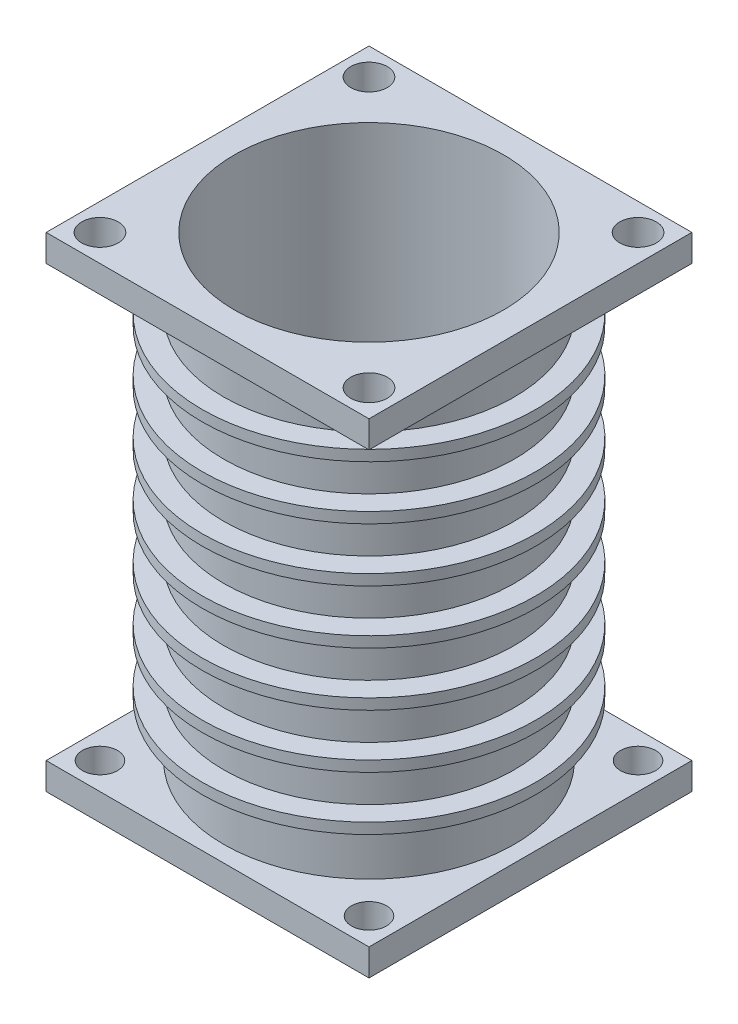
ISO-10303-21;
HEADER;
FILE_DESCRIPTION(('STEP AP214'),'2;1');
FILE_NAME('part.step','',(''),(''),'','','');
FILE_SCHEMA(('AUTOMOTIVE_DESIGN { 1 0 10303 214 1 1 1 1 }'));
ENDSEC;
DATA;
#1=APPLICATION_CONTEXT('core data for automotive mechanical design processes');
#2=APPLICATION_PROTOCOL_DEFINITION('international standard','automotive_design',2000,#1);
#3=PRODUCT_CONTEXT('',#1,'mechanical');
#4=PRODUCT('Part','Part','',(#3));
#5=PRODUCT_RELATED_PRODUCT_CATEGORY('part','',(#4));
#6=PRODUCT_DEFINITION_FORMATION('','',#4);
#7=PRODUCT_DEFINITION_CONTEXT('part definition',#1,'design');
#8=PRODUCT_DEFINITION('design','',#6,#7);
#9=PRODUCT_DEFINITION_SHAPE('','',#8);
#10=(LENGTH_UNIT() NAMED_UNIT(*) SI_UNIT(.MILLI.,.METRE.));
#11=(NAMED_UNIT(*) PLANE_ANGLE_UNIT() SI_UNIT($,.RADIAN.));
#12=(NAMED_UNIT(*) SI_UNIT($,.STERADIAN.) SOLID_ANGLE_UNIT());
#13=UNCERTAINTY_MEASURE_WITH_UNIT(LENGTH_MEASURE(1.E-05),#10,'distance_accuracy_value','');
#14=(GEOMETRIC_REPRESENTATION_CONTEXT(3) GLOBAL_UNCERTAINTY_ASSIGNED_CONTEXT((#13)) GLOBAL_UNIT_ASSIGNED_CONTEXT((#10,
#11,#12)) REPRESENTATION_CONTEXT('',''));
#15=CARTESIAN_POINT('',(0.,0.,0.));
#16=DIRECTION('',(0.,0.,1.));
#17=DIRECTION('',(1.,0.,0.));
#18=AXIS2_PLACEMENT_3D('',#15,#16,#17);
#19=CARTESIAN_POINT('',(0.,113.074454152936,0.));
#20=DIRECTION('',(0.,-1.,0.));
#21=DIRECTION('',(0.,0.,-1.));
#22=AXIS2_PLACEMENT_3D('',#19,#20,#21);
#23=CYLINDRICAL_SURFACE('',#22,54.);
#24=CARTESIAN_POINT('',(0.,77.0744541529356,0.));
#25=DIRECTION('',(0.,1.,0.));
#26=DIRECTION('',(0.,0.,1.));
#27=AXIS2_PLACEMENT_3D('',#24,#25,#26);
#28=CIRCLE('',#27,54.);
#29=CARTESIAN_POINT('',(0.,77.0744541529356,54.));
#30=VERTEX_POINT('',#29);
#31=EDGE_CURVE('E175',#30,#30,#28,.T.);
#32=ORIENTED_EDGE('',*,*,#31,.T.);
#33=EDGE_LOOP('',(#32));
#34=FACE_BOUND('',#33,.T.);
#35=CARTESIAN_POINT('',(0.,93.0744541529356,0.));
#36=DIRECTION('',(0.,1.,0.));
#37=DIRECTION('',(0.,0.,1.));
#38=AXIS2_PLACEMENT_3D('',#35,#36,#37);
#39=CIRCLE('',#38,54.);
#40=CARTESIAN_POINT('',(0.,93.0744541529356,54.));
#41=VERTEX_POINT('',#40);
#42=EDGE_CURVE('E244',#41,#41,#39,.T.);
#43=ORIENTED_EDGE('',*,*,#42,.F.);
#44=EDGE_LOOP('',(#43));
#45=FACE_BOUND('',#44,.T.);
#46=ADVANCED_FACE('F37',(#34,#45),#23,.T.);
#47=CARTESIAN_POINT('',(0.,93.0744541529356,0.));
#48=DIRECTION('',(0.,1.,0.));
#49=DIRECTION('',(0.,0.,1.));
#50=AXIS2_PLACEMENT_3D('',#47,#48,#49);
#51=PLANE('',#50);
#52=ORIENTED_EDGE('',*,*,#42,.T.);
#53=EDGE_LOOP('',(#52));
#54=FACE_BOUND('',#53,.T.);
#55=CARTESIAN_POINT('',(0.,93.0744541529356,0.));
#56=DIRECTION('',(0.,1.,0.));
#57=DIRECTION('',(0.,0.,1.));
#58=AXIS2_PLACEMENT_3D('',#55,#56,#57);
#59=CIRCLE('',#58,62.);
#60=CARTESIAN_POINT('',(0.,93.0744541529356,62.));
#61=VERTEX_POINT('',#60);
#62=EDGE_CURVE('E183',#61,#61,#59,.T.);
#63=ORIENTED_EDGE('',*,*,#62,.F.);
#64=EDGE_LOOP('',(#63));
#65=FACE_BOUND('',#64,.T.);
#66=ADVANCED_FACE('F301',(#54,#65),#51,.F.);
#67=CARTESIAN_POINT('',(0.,97.0744541529356,0.));
#68=DIRECTION('',(0.,1.,0.));
#69=DIRECTION('',(0.,0.,1.));
#70=AXIS2_PLACEMENT_3D('',#67,#68,#69);
#71=PLANE('',#70);
#72=CARTESIAN_POINT('',(0.,97.0744541529356,0.));
#73=DIRECTION('',(0.,1.,0.));
#74=DIRECTION('',(0.,0.,1.));
#75=AXIS2_PLACEMENT_3D('',#72,#73,#74);
#76=CIRCLE('',#75,54.);
#77=CARTESIAN_POINT('',(0.,97.0744541529356,54.));
#78=VERTEX_POINT('',#77);
#79=EDGE_CURVE('E182',#78,#78,#76,.T.);
#80=ORIENTED_EDGE('',*,*,#79,.F.);
#81=EDGE_LOOP('',(#80));
#82=FACE_BOUND('',#81,.T.);
#83=CARTESIAN_POINT('',(0.,97.0744541529356,0.));
#84=DIRECTION('',(0.,1.,0.));
#85=DIRECTION('',(0.,0.,1.));
#86=AXIS2_PLACEMENT_3D('',#83,#84,#85);
#87=CIRCLE('',#86,62.);
#88=CARTESIAN_POINT('',(0.,97.0744541529356,62.));
#89=VERTEX_POINT('',#88);
#90=EDGE_CURVE('E179',#89,#89,#87,.T.);
#91=ORIENTED_EDGE('',*,*,#90,.T.);
#92=EDGE_LOOP('',(#91));
#93=FACE_BOUND('',#92,.T.);
#94=ADVANCED_FACE('F308',(#82,#93),#71,.T.);
#95=CARTESIAN_POINT('',(0.,97.0744541529356,0.));
#96=DIRECTION('',(0.,-1.,0.));
#97=DIRECTION('',(0.,0.,-1.));
#98=AXIS2_PLACEMENT_3D('',#95,#96,#97);
#99=CYLINDRICAL_SURFACE('',#98,62.);
#100=ORIENTED_EDGE('',*,*,#90,.F.);
#101=EDGE_LOOP('',(#100));
#102=FACE_BOUND('',#101,.T.);
#103=ORIENTED_EDGE('',*,*,#62,.T.);
#104=EDGE_LOOP('',(#103));
#105=FACE_BOUND('',#104,.T.);
#106=ADVANCED_FACE('F395',(#102,#105),#99,.T.);
#107=CARTESIAN_POINT('',(0.,-56.9255458470644,0.));
#108=DIRECTION('',(0.,1.,0.));
#109=DIRECTION('',(0.,0.,1.));
#110=AXIS2_PLACEMENT_3D('',#107,#108,#109);
#111=CYLINDRICAL_SURFACE('',#110,50.);
#112=CARTESIAN_POINT('',(0.,-56.9255458470644,0.));
#113=DIRECTION('',(0.,1.,0.));
#114=DIRECTION('',(0.,0.,1.));
#115=AXIS2_PLACEMENT_3D('',#112,#113,#114);
#116=CIRCLE('',#115,50.);
#117=CARTESIAN_POINT('',(0.,-56.9255458470644,50.));
#118=VERTEX_POINT('',#117);
#119=EDGE_CURVE('E189',#118,#118,#116,.T.);
#120=ORIENTED_EDGE('',*,*,#119,.F.);
#121=EDGE_LOOP('',(#120));
#122=FACE_BOUND('',#121,.T.);
#123=CARTESIAN_POINT('',(0.,123.074454152936,0.));
#124=DIRECTION('',(0.,1.,0.));
#125=DIRECTION('',(0.,0.,1.));
#126=AXIS2_PLACEMENT_3D('',#123,#124,#125);
#127=CIRCLE('',#126,50.);
#128=CARTESIAN_POINT('',(0.,123.074454152936,50.));
#129=VERTEX_POINT('',#128);
#130=EDGE_CURVE('E555',#129,#129,#127,.F.);
#131=ORIENTED_EDGE('',*,*,#130,.F.);
#132=EDGE_LOOP('',(#131));
#133=FACE_BOUND('',#132,.T.);
#134=ADVANCED_FACE('F316',(#122,#133),#111,.F.);
#135=ORIENTED_EDGE('',*,*,#79,.T.);
#136=EDGE_LOOP('',(#135));
#137=FACE_BOUND('',#136,.T.);
#138=CARTESIAN_POINT('',(0.,113.074454152936,0.));
#139=DIRECTION('',(0.,1.,0.));
#140=DIRECTION('',(0.,0.,1.));
#141=AXIS2_PLACEMENT_3D('',#138,#139,#140);
#142=CIRCLE('',#141,54.);
#143=CARTESIAN_POINT('',(0.,113.074454152936,54.));
#144=VERTEX_POINT('',#143);
#145=EDGE_CURVE('E186',#144,#144,#142,.T.);
#146=ORIENTED_EDGE('',*,*,#145,.F.);
#147=EDGE_LOOP('',(#146));
#148=FACE_BOUND('',#147,.T.);
#149=ADVANCED_FACE('F303',(#137,#148),#23,.T.);
#150=CARTESIAN_POINT('',(0.,73.0744541529356,0.));
#151=DIRECTION('',(0.,1.,0.));
#152=DIRECTION('',(0.,0.,1.));
#153=AXIS2_PLACEMENT_3D('',#150,#151,#152);
#154=PLANE('',#153);
#155=CARTESIAN_POINT('',(0.,73.0744541529356,0.));
#156=DIRECTION('',(0.,1.,0.));
#157=DIRECTION('',(0.,0.,1.));
#158=AXIS2_PLACEMENT_3D('',#155,#156,#157);
#159=CIRCLE('',#158,54.);
#160=CARTESIAN_POINT('',(0.,73.0744541529356,54.));
#161=VERTEX_POINT('',#160);
#162=EDGE_CURVE('E247',#161,#161,#159,.T.);
#163=ORIENTED_EDGE('',*,*,#162,.T.);
#164=EDGE_LOOP('',(#163));
#165=FACE_BOUND('',#164,.T.);
#166=CARTESIAN_POINT('',(0.,73.0744541529356,0.));
#167=DIRECTION('',(0.,1.,0.));
#168=DIRECTION('',(0.,0.,1.));
#169=AXIS2_PLACEMENT_3D('',#166,#167,#168);
#170=CIRCLE('',#169,62.);
#171=CARTESIAN_POINT('',(0.,73.0744541529356,62.));
#172=VERTEX_POINT('',#171);
#173=EDGE_CURVE('E176',#172,#172,#170,.T.);
#174=ORIENTED_EDGE('',*,*,#173,.F.);
#175=EDGE_LOOP('',(#174));
#176=FACE_BOUND('',#175,.T.);
#177=ADVANCED_FACE('F315',(#165,#176),#154,.F.);
#178=CARTESIAN_POINT('',(0.,77.0744541529356,0.));
#179=DIRECTION('',(0.,1.,0.));
#180=DIRECTION('',(0.,0.,1.));
#181=AXIS2_PLACEMENT_3D('',#178,#179,#180);
#182=PLANE('',#181);
#183=ORIENTED_EDGE('',*,*,#31,.F.);
#184=EDGE_LOOP('',(#183));
#185=FACE_BOUND('',#184,.T.);
#186=CARTESIAN_POINT('',(0.,77.0744541529356,0.));
#187=DIRECTION('',(0.,1.,0.));
#188=DIRECTION('',(0.,0.,1.));
#189=AXIS2_PLACEMENT_3D('',#186,#187,#188);
#190=CIRCLE('',#189,62.);
#191=CARTESIAN_POINT('',(0.,77.0744541529356,62.));
#192=VERTEX_POINT('',#191);
#193=EDGE_CURVE('E172',#192,#192,#190,.T.);
#194=ORIENTED_EDGE('',*,*,#193,.T.);
#195=EDGE_LOOP('',(#194));
#196=FACE_BOUND('',#195,.T.);
#197=ADVANCED_FACE('F331',(#185,#196),#182,.T.);
#198=CARTESIAN_POINT('',(0.,77.0744541529356,0.));
#199=DIRECTION('',(0.,-1.,0.));
#200=DIRECTION('',(0.,0.,-1.));
#201=AXIS2_PLACEMENT_3D('',#198,#199,#200);
#202=CYLINDRICAL_SURFACE('',#201,62.);
#203=ORIENTED_EDGE('',*,*,#193,.F.);
#204=EDGE_LOOP('',(#203));
#205=FACE_BOUND('',#204,.T.);
#206=ORIENTED_EDGE('',*,*,#173,.T.);
#207=EDGE_LOOP('',(#206));
#208=FACE_BOUND('',#207,.T.);
#209=ADVANCED_FACE('F321',(#205,#208),#202,.T.);
#210=CARTESIAN_POINT('',(0.,57.0744541529356,0.));
#211=DIRECTION('',(0.,1.,0.));
#212=DIRECTION('',(0.,0.,1.));
#213=AXIS2_PLACEMENT_3D('',#210,#211,#212);
#214=CIRCLE('',#213,54.);
#215=CARTESIAN_POINT('',(0.,57.0744541529356,54.));
#216=VERTEX_POINT('',#215);
#217=EDGE_CURVE('E168',#216,#216,#214,.T.);
#218=ORIENTED_EDGE('',*,*,#217,.T.);
#219=EDGE_LOOP('',(#218));
#220=FACE_BOUND('',#219,.T.);
#221=ORIENTED_EDGE('',*,*,#162,.F.);
#222=EDGE_LOOP('',(#221));
#223=FACE_BOUND('',#222,.T.);
#224=ADVANCED_FACE('F304',(#220,#223),#23,.T.);
#225=CARTESIAN_POINT('',(0.,53.0744541529356,0.));
#226=DIRECTION('',(0.,1.,0.));
#227=DIRECTION('',(0.,0.,1.));
#228=AXIS2_PLACEMENT_3D('',#225,#226,#227);
#229=PLANE('',#228);
#230=CARTESIAN_POINT('',(0.,53.0744541529356,0.));
#231=DIRECTION('',(0.,1.,0.));
#232=DIRECTION('',(0.,0.,1.));
#233=AXIS2_PLACEMENT_3D('',#230,#231,#232);
#234=CIRCLE('',#233,54.);
#235=CARTESIAN_POINT('',(0.,53.0744541529356,54.));
#236=VERTEX_POINT('',#235);
#237=EDGE_CURVE('E252',#236,#236,#234,.T.);
#238=ORIENTED_EDGE('',*,*,#237,.T.);
#239=EDGE_LOOP('',(#238));
#240=FACE_BOUND('',#239,.T.);
#241=CARTESIAN_POINT('',(0.,53.0744541529356,0.));
#242=DIRECTION('',(0.,1.,0.));
#243=DIRECTION('',(0.,0.,1.));
#244=AXIS2_PLACEMENT_3D('',#241,#242,#243);
#245=CIRCLE('',#244,62.);
#246=CARTESIAN_POINT('',(0.,53.0744541529356,62.));
#247=VERTEX_POINT('',#246);
#248=EDGE_CURVE('E169',#247,#247,#245,.T.);
#249=ORIENTED_EDGE('',*,*,#248,.F.);
#250=EDGE_LOOP('',(#249));
#251=FACE_BOUND('',#250,.T.);
#252=ADVANCED_FACE('F320',(#240,#251),#229,.F.);
#253=CARTESIAN_POINT('',(0.,57.0744541529356,0.));
#254=DIRECTION('',(0.,1.,0.));
#255=DIRECTION('',(0.,0.,1.));
#256=AXIS2_PLACEMENT_3D('',#253,#254,#255);
#257=PLANE('',#256);
#258=ORIENTED_EDGE('',*,*,#217,.F.);
#259=EDGE_LOOP('',(#258));
#260=FACE_BOUND('',#259,.T.);
#261=CARTESIAN_POINT('',(0.,57.0744541529356,0.));
#262=DIRECTION('',(0.,1.,0.));
#263=DIRECTION('',(0.,0.,1.));
#264=AXIS2_PLACEMENT_3D('',#261,#262,#263);
#265=CIRCLE('',#264,62.);
#266=CARTESIAN_POINT('',(0.,57.0744541529356,62.));
#267=VERTEX_POINT('',#266);
#268=EDGE_CURVE('E165',#267,#267,#265,.T.);
#269=ORIENTED_EDGE('',*,*,#268,.T.);
#270=EDGE_LOOP('',(#269));
#271=FACE_BOUND('',#270,.T.);
#272=ADVANCED_FACE('F328',(#260,#271),#257,.T.);
#273=CARTESIAN_POINT('',(0.,57.0744541529356,0.));
#274=DIRECTION('',(0.,-1.,0.));
#275=DIRECTION('',(0.,0.,-1.));
#276=AXIS2_PLACEMENT_3D('',#273,#274,#275);
#277=CYLINDRICAL_SURFACE('',#276,62.);
#278=ORIENTED_EDGE('',*,*,#268,.F.);
#279=EDGE_LOOP('',(#278));
#280=FACE_BOUND('',#279,.T.);
#281=ORIENTED_EDGE('',*,*,#248,.T.);
#282=EDGE_LOOP('',(#281));
#283=FACE_BOUND('',#282,.T.);
#284=ADVANCED_FACE('F337',(#280,#283),#277,.T.);
#285=CARTESIAN_POINT('',(0.,37.0744541529356,0.));
#286=DIRECTION('',(0.,1.,0.));
#287=DIRECTION('',(0.,0.,1.));
#288=AXIS2_PLACEMENT_3D('',#285,#286,#287);
#289=CIRCLE('',#288,54.);
#290=CARTESIAN_POINT('',(0.,37.0744541529356,54.));
#291=VERTEX_POINT('',#290);
#292=EDGE_CURVE('E161',#291,#291,#289,.T.);
#293=ORIENTED_EDGE('',*,*,#292,.T.);
#294=EDGE_LOOP('',(#293));
#295=FACE_BOUND('',#294,.T.);
#296=ORIENTED_EDGE('',*,*,#237,.F.);
#297=EDGE_LOOP('',(#296));
#298=FACE_BOUND('',#297,.T.);
#299=ADVANCED_FACE('F323',(#295,#298),#23,.T.);
#300=CARTESIAN_POINT('',(0.,33.0744541529356,0.));
#301=DIRECTION('',(0.,1.,0.));
#302=DIRECTION('',(0.,0.,1.));
#303=AXIS2_PLACEMENT_3D('',#300,#301,#302);
#304=PLANE('',#303);
#305=CARTESIAN_POINT('',(0.,33.0744541529356,0.));
#306=DIRECTION('',(0.,1.,0.));
#307=DIRECTION('',(0.,0.,1.));
#308=AXIS2_PLACEMENT_3D('',#305,#306,#307);
#309=CIRCLE('',#308,54.);
#310=CARTESIAN_POINT('',(0.,33.0744541529356,54.));
#311=VERTEX_POINT('',#310);
#312=EDGE_CURVE('E257',#311,#311,#309,.T.);
#313=ORIENTED_EDGE('',*,*,#312,.T.);
#314=EDGE_LOOP('',(#313));
#315=FACE_BOUND('',#314,.T.);
#316=CARTESIAN_POINT('',(0.,33.0744541529356,0.));
#317=DIRECTION('',(0.,1.,0.));
#318=DIRECTION('',(0.,0.,1.));
#319=AXIS2_PLACEMENT_3D('',#316,#317,#318);
#320=CIRCLE('',#319,62.);
#321=CARTESIAN_POINT('',(0.,33.0744541529356,62.));
#322=VERTEX_POINT('',#321);
#323=EDGE_CURVE('E162',#322,#322,#320,.T.);
#324=ORIENTED_EDGE('',*,*,#323,.F.);
#325=EDGE_LOOP('',(#324));
#326=FACE_BOUND('',#325,.T.);
#327=ADVANCED_FACE('F336',(#315,#326),#304,.F.);
#328=CARTESIAN_POINT('',(0.,37.0744541529356,0.));
#329=DIRECTION('',(0.,1.,0.));
#330=DIRECTION('',(0.,0.,1.));
#331=AXIS2_PLACEMENT_3D('',#328,#329,#330);
#332=PLANE('',#331);
#333=ORIENTED_EDGE('',*,*,#292,.F.);
#334=EDGE_LOOP('',(#333));
#335=FACE_BOUND('',#334,.T.);
#336=CARTESIAN_POINT('',(0.,37.0744541529356,0.));
#337=DIRECTION('',(0.,1.,0.));
#338=DIRECTION('',(0.,0.,1.));
#339=AXIS2_PLACEMENT_3D('',#336,#337,#338);
#340=CIRCLE('',#339,62.);
#341=CARTESIAN_POINT('',(0.,37.0744541529356,62.));
#342=VERTEX_POINT('',#341);
#343=EDGE_CURVE('E158',#342,#342,#340,.T.);
#344=ORIENTED_EDGE('',*,*,#343,.T.);
#345=EDGE_LOOP('',(#344));
#346=FACE_BOUND('',#345,.T.);
#347=ADVANCED_FACE('F343',(#335,#346),#332,.T.);
#348=CARTESIAN_POINT('',(0.,37.0744541529356,0.));
#349=DIRECTION('',(0.,-1.,0.));
#350=DIRECTION('',(0.,0.,-1.));
#351=AXIS2_PLACEMENT_3D('',#348,#349,#350);
#352=CYLINDRICAL_SURFACE('',#351,62.);
#353=ORIENTED_EDGE('',*,*,#343,.F.);
#354=EDGE_LOOP('',(#353));
#355=FACE_BOUND('',#354,.T.);
#356=ORIENTED_EDGE('',*,*,#323,.T.);
#357=EDGE_LOOP('',(#356));
#358=FACE_BOUND('',#357,.T.);
#359=ADVANCED_FACE('F351',(#355,#358),#352,.T.);
#360=CARTESIAN_POINT('',(0.,17.0744541529356,0.));
#361=DIRECTION('',(0.,1.,0.));
#362=DIRECTION('',(0.,0.,1.));
#363=AXIS2_PLACEMENT_3D('',#360,#361,#362);
#364=CIRCLE('',#363,54.);
#365=CARTESIAN_POINT('',(0.,17.0744541529356,54.));
#366=VERTEX_POINT('',#365);
#367=EDGE_CURVE('E154',#366,#366,#364,.T.);
#368=ORIENTED_EDGE('',*,*,#367,.T.);
#369=EDGE_LOOP('',(#368));
#370=FACE_BOUND('',#369,.T.);
#371=ORIENTED_EDGE('',*,*,#312,.F.);
#372=EDGE_LOOP('',(#371));
#373=FACE_BOUND('',#372,.T.);
#374=ADVANCED_FACE('F299',(#370,#373),#23,.T.);
#375=CARTESIAN_POINT('',(0.,13.0744541529356,0.));
#376=DIRECTION('',(0.,1.,0.));
#377=DIRECTION('',(0.,0.,1.));
#378=AXIS2_PLACEMENT_3D('',#375,#376,#377);
#379=PLANE('',#378);
#380=CARTESIAN_POINT('',(0.,13.0744541529356,0.));
#381=DIRECTION('',(0.,1.,0.));
#382=DIRECTION('',(0.,0.,1.));
#383=AXIS2_PLACEMENT_3D('',#380,#381,#382);
#384=CIRCLE('',#383,54.);
#385=CARTESIAN_POINT('',(0.,13.0744541529356,54.));
#386=VERTEX_POINT('',#385);
#387=EDGE_CURVE('E262',#386,#386,#384,.T.);
#388=ORIENTED_EDGE('',*,*,#387,.T.);
#389=EDGE_LOOP('',(#388));
#390=FACE_BOUND('',#389,.T.);
#391=CARTESIAN_POINT('',(0.,13.0744541529356,0.));
#392=DIRECTION('',(0.,1.,0.));
#393=DIRECTION('',(0.,0.,1.));
#394=AXIS2_PLACEMENT_3D('',#391,#392,#393);
#395=CIRCLE('',#394,62.);
#396=CARTESIAN_POINT('',(0.,13.0744541529356,62.));
#397=VERTEX_POINT('',#396);
#398=EDGE_CURVE('E155',#397,#397,#395,.T.);
#399=ORIENTED_EDGE('',*,*,#398,.F.);
#400=EDGE_LOOP('',(#399));
#401=FACE_BOUND('',#400,.T.);
#402=ADVANCED_FACE('F350',(#390,#401),#379,.F.);
#403=CARTESIAN_POINT('',(0.,17.0744541529356,0.));
#404=DIRECTION('',(0.,1.,0.));
#405=DIRECTION('',(0.,0.,1.));
#406=AXIS2_PLACEMENT_3D('',#403,#404,#405);
#407=PLANE('',#406);
#408=ORIENTED_EDGE('',*,*,#367,.F.);
#409=EDGE_LOOP('',(#408));
#410=FACE_BOUND('',#409,.T.);
#411=CARTESIAN_POINT('',(0.,17.0744541529356,0.));
#412=DIRECTION('',(0.,1.,0.));
#413=DIRECTION('',(0.,0.,1.));
#414=AXIS2_PLACEMENT_3D('',#411,#412,#413);
#415=CIRCLE('',#414,62.);
#416=CARTESIAN_POINT('',(0.,17.0744541529356,62.));
#417=VERTEX_POINT('',#416);
#418=EDGE_CURVE('E151',#417,#417,#415,.T.);
#419=ORIENTED_EDGE('',*,*,#418,.T.);
#420=EDGE_LOOP('',(#419));
#421=FACE_BOUND('',#420,.T.);
#422=ADVANCED_FACE('F357',(#410,#421),#407,.T.);
#423=CARTESIAN_POINT('',(0.,17.0744541529356,0.));
#424=DIRECTION('',(0.,-1.,0.));
#425=DIRECTION('',(0.,0.,-1.));
#426=AXIS2_PLACEMENT_3D('',#423,#424,#425);
#427=CYLINDRICAL_SURFACE('',#426,62.);
#428=ORIENTED_EDGE('',*,*,#418,.F.);
#429=EDGE_LOOP('',(#428));
#430=FACE_BOUND('',#429,.T.);
#431=ORIENTED_EDGE('',*,*,#398,.T.);
#432=EDGE_LOOP('',(#431));
#433=FACE_BOUND('',#432,.T.);
#434=ADVANCED_FACE('F297',(#430,#433),#427,.T.);
#435=CARTESIAN_POINT('',(0.,-2.92554584706443,0.));
#436=DIRECTION('',(0.,1.,0.));
#437=DIRECTION('',(0.,0.,1.));
#438=AXIS2_PLACEMENT_3D('',#435,#436,#437);
#439=CIRCLE('',#438,54.);
#440=CARTESIAN_POINT('',(0.,-2.92554584706443,54.));
#441=VERTEX_POINT('',#440);
#442=EDGE_CURVE('E147',#441,#441,#439,.T.);
#443=ORIENTED_EDGE('',*,*,#442,.T.);
#444=EDGE_LOOP('',(#443));
#445=FACE_BOUND('',#444,.T.);
#446=ORIENTED_EDGE('',*,*,#387,.F.);
#447=EDGE_LOOP('',(#446));
#448=FACE_BOUND('',#447,.T.);
#449=ADVANCED_FACE('F274',(#445,#448),#23,.T.);
#450=CARTESIAN_POINT('',(0.,-6.92554584706444,0.));
#451=DIRECTION('',(0.,1.,0.));
#452=DIRECTION('',(0.,0.,1.));
#453=AXIS2_PLACEMENT_3D('',#450,#451,#452);
#454=PLANE('',#453);
#455=CARTESIAN_POINT('',(0.,-6.92554584706444,0.));
#456=DIRECTION('',(0.,1.,0.));
#457=DIRECTION('',(0.,0.,1.));
#458=AXIS2_PLACEMENT_3D('',#455,#456,#457);
#459=CIRCLE('',#458,54.);
#460=CARTESIAN_POINT('',(0.,-6.92554584706444,54.));
#461=VERTEX_POINT('',#460);
#462=EDGE_CURVE('E47',#461,#461,#459,.T.);
#463=ORIENTED_EDGE('',*,*,#462,.T.);
#464=EDGE_LOOP('',(#463));
#465=FACE_BOUND('',#464,.T.);
#466=CARTESIAN_POINT('',(0.,-6.92554584706444,0.));
#467=DIRECTION('',(0.,1.,0.));
#468=DIRECTION('',(0.,0.,1.));
#469=AXIS2_PLACEMENT_3D('',#466,#467,#468);
#470=CIRCLE('',#469,62.);
#471=CARTESIAN_POINT('',(0.,-6.92554584706444,62.));
#472=VERTEX_POINT('',#471);
#473=EDGE_CURVE('E148',#472,#472,#470,.T.);
#474=ORIENTED_EDGE('',*,*,#473,.F.);
#475=EDGE_LOOP('',(#474));
#476=FACE_BOUND('',#475,.T.);
#477=ADVANCED_FACE('F281',(#465,#476),#454,.F.);
#478=CARTESIAN_POINT('',(0.,-2.92554584706443,0.));
#479=DIRECTION('',(0.,1.,0.));
#480=DIRECTION('',(0.,0.,1.));
#481=AXIS2_PLACEMENT_3D('',#478,#479,#480);
#482=PLANE('',#481);
#483=ORIENTED_EDGE('',*,*,#442,.F.);
#484=EDGE_LOOP('',(#483));
#485=FACE_BOUND('',#484,.T.);
#486=CARTESIAN_POINT('',(0.,-2.92554584706443,0.));
#487=DIRECTION('',(0.,1.,0.));
#488=DIRECTION('',(0.,0.,1.));
#489=AXIS2_PLACEMENT_3D('',#486,#487,#488);
#490=CIRCLE('',#489,62.);
#491=CARTESIAN_POINT('',(0.,-2.92554584706443,62.));
#492=VERTEX_POINT('',#491);
#493=EDGE_CURVE('E144',#492,#492,#490,.T.);
#494=ORIENTED_EDGE('',*,*,#493,.T.);
#495=EDGE_LOOP('',(#494));
#496=FACE_BOUND('',#495,.T.);
#497=ADVANCED_FACE('F277',(#485,#496),#482,.T.);
#498=CARTESIAN_POINT('',(0.,-2.92554584706443,0.));
#499=DIRECTION('',(0.,-1.,0.));
#500=DIRECTION('',(0.,0.,-1.));
#501=AXIS2_PLACEMENT_3D('',#498,#499,#500);
#502=CYLINDRICAL_SURFACE('',#501,62.);
#503=ORIENTED_EDGE('',*,*,#493,.F.);
#504=EDGE_LOOP('',(#503));
#505=FACE_BOUND('',#504,.T.);
#506=ORIENTED_EDGE('',*,*,#473,.T.);
#507=EDGE_LOOP('',(#506));
#508=FACE_BOUND('',#507,.T.);
#509=ADVANCED_FACE('F280',(#505,#508),#502,.T.);
#510=CARTESIAN_POINT('',(0.,-22.9255458470644,0.));
#511=DIRECTION('',(0.,1.,0.));
#512=DIRECTION('',(0.,0.,1.));
#513=AXIS2_PLACEMENT_3D('',#510,#511,#512);
#514=CIRCLE('',#513,54.);
#515=CARTESIAN_POINT('',(0.,-22.9255458470644,54.));
#516=VERTEX_POINT('',#515);
#517=EDGE_CURVE('E41',#516,#516,#514,.T.);
#518=ORIENTED_EDGE('',*,*,#517,.T.);
#519=EDGE_LOOP('',(#518));
#520=FACE_BOUND('',#519,.T.);
#521=ORIENTED_EDGE('',*,*,#462,.F.);
#522=EDGE_LOOP('',(#521));
#523=FACE_BOUND('',#522,.T.);
#524=ADVANCED_FACE('F287',(#520,#523),#23,.T.);
#525=CARTESIAN_POINT('',(0.,-26.9255458470644,0.));
#526=DIRECTION('',(0.,1.,0.));
#527=DIRECTION('',(0.,0.,1.));
#528=AXIS2_PLACEMENT_3D('',#525,#526,#527);
#529=PLANE('',#528);
#530=CARTESIAN_POINT('',(0.,-26.9255458470644,0.));
#531=DIRECTION('',(0.,1.,0.));
#532=DIRECTION('',(0.,0.,1.));
#533=AXIS2_PLACEMENT_3D('',#530,#531,#532);
#534=CIRCLE('',#533,54.);
#535=CARTESIAN_POINT('',(0.,-26.9255458470644,54.));
#536=VERTEX_POINT('',#535);
#537=EDGE_CURVE('E11',#536,#536,#534,.T.);
#538=ORIENTED_EDGE('',*,*,#537,.T.);
#539=EDGE_LOOP('',(#538));
#540=FACE_BOUND('',#539,.T.);
#541=CARTESIAN_POINT('',(0.,-26.9255458470644,0.));
#542=DIRECTION('',(0.,1.,0.));
#543=DIRECTION('',(0.,0.,1.));
#544=AXIS2_PLACEMENT_3D('',#541,#542,#543);
#545=CIRCLE('',#544,62.);
#546=CARTESIAN_POINT('',(0.,-26.9255458470644,62.));
#547=VERTEX_POINT('',#546);
#548=EDGE_CURVE('E133',#547,#547,#545,.T.);
#549=ORIENTED_EDGE('',*,*,#548,.F.);
#550=EDGE_LOOP('',(#549));
#551=FACE_BOUND('',#550,.T.);
#552=ADVANCED_FACE('F477',(#540,#551),#529,.F.);
#553=CARTESIAN_POINT('',(0.,-22.9255458470644,0.));
#554=DIRECTION('',(0.,1.,0.));
#555=DIRECTION('',(0.,0.,1.));
#556=AXIS2_PLACEMENT_3D('',#553,#554,#555);
#557=PLANE('',#556);
#558=ORIENTED_EDGE('',*,*,#517,.F.);
#559=EDGE_LOOP('',(#558));
#560=FACE_BOUND('',#559,.T.);
#561=CARTESIAN_POINT('',(0.,-22.9255458470644,0.));
#562=DIRECTION('',(0.,1.,0.));
#563=DIRECTION('',(0.,0.,1.));
#564=AXIS2_PLACEMENT_3D('',#561,#562,#563);
#565=CIRCLE('',#564,62.);
#566=CARTESIAN_POINT('',(0.,-22.9255458470644,62.));
#567=VERTEX_POINT('',#566);
#568=EDGE_CURVE('E136',#567,#567,#565,.T.);
#569=ORIENTED_EDGE('',*,*,#568,.T.);
#570=EDGE_LOOP('',(#569));
#571=FACE_BOUND('',#570,.T.);
#572=ADVANCED_FACE('F480',(#560,#571),#557,.T.);
#573=CARTESIAN_POINT('',(0.,-22.9255458470644,0.));
#574=DIRECTION('',(0.,-1.,0.));
#575=DIRECTION('',(0.,0.,-1.));
#576=AXIS2_PLACEMENT_3D('',#573,#574,#575);
#577=CYLINDRICAL_SURFACE('',#576,62.);
#578=ORIENTED_EDGE('',*,*,#568,.F.);
#579=EDGE_LOOP('',(#578));
#580=FACE_BOUND('',#579,.T.);
#581=ORIENTED_EDGE('',*,*,#548,.T.);
#582=EDGE_LOOP('',(#581));
#583=FACE_BOUND('',#582,.T.);
#584=ADVANCED_FACE('F448',(#580,#583),#577,.T.);
#585=CARTESIAN_POINT('',(50.0000000000001,-46.9255458470644,50.));
#586=DIRECTION('',(0.,-1.,0.));
#587=DIRECTION('',(0.,0.,-1.));
#588=AXIS2_PLACEMENT_3D('',#585,#586,#587);
#589=CYLINDRICAL_SURFACE('',#588,6.52);
#590=CARTESIAN_POINT('',(50.0000000000001,-46.9255458470644,50.));
#591=DIRECTION('',(0.,1.,0.));
#592=DIRECTION('',(0.,0.,1.));
#593=AXIS2_PLACEMENT_3D('',#590,#591,#592);
#594=CIRCLE('',#593,6.52);
#595=CARTESIAN_POINT('',(50.0000000000001,-46.9255458470644,56.5200000000001));
#596=VERTEX_POINT('',#595);
#597=EDGE_CURVE('E196',#596,#596,#594,.T.);
#598=ORIENTED_EDGE('',*,*,#597,.T.);
#599=EDGE_LOOP('',(#598));
#600=FACE_BOUND('',#599,.T.);
#601=CARTESIAN_POINT('',(50.0000000000001,-56.9255458470644,50.));
#602=DIRECTION('',(0.,1.,0.));
#603=DIRECTION('',(0.,0.,1.));
#604=AXIS2_PLACEMENT_3D('',#601,#602,#603);
#605=CIRCLE('',#604,6.52);
#606=CARTESIAN_POINT('',(50.0000000000001,-56.9255458470644,56.5200000000001));
#607=VERTEX_POINT('',#606);
#608=EDGE_CURVE('E195',#607,#607,#605,.T.);
#609=ORIENTED_EDGE('',*,*,#608,.F.);
#610=EDGE_LOOP('',(#609));
#611=FACE_BOUND('',#610,.T.);
#612=ADVANCED_FACE('F39',(#600,#611),#589,.F.);
#613=CARTESIAN_POINT('',(50.0000000000001,-46.9255458470644,-50.));
#614=DIRECTION('',(0.,-1.,0.));
#615=DIRECTION('',(0.,0.,-1.));
#616=AXIS2_PLACEMENT_3D('',#613,#614,#615);
#617=CYLINDRICAL_SURFACE('',#616,6.52);
#618=CARTESIAN_POINT('',(50.0000000000001,-46.9255458470644,-50.));
#619=DIRECTION('',(0.,1.,0.));
#620=DIRECTION('',(0.,0.,1.));
#621=AXIS2_PLACEMENT_3D('',#618,#619,#620);
#622=CIRCLE('',#621,6.52);
#623=CARTESIAN_POINT('',(50.0000000000001,-46.9255458470644,-43.48));
#624=VERTEX_POINT('',#623);
#625=EDGE_CURVE('E199',#624,#624,#622,.T.);
#626=ORIENTED_EDGE('',*,*,#625,.T.);
#627=EDGE_LOOP('',(#626));
#628=FACE_BOUND('',#627,.T.);
#629=CARTESIAN_POINT('',(50.0000000000001,-56.9255458470644,-50.));
#630=DIRECTION('',(0.,1.,0.));
#631=DIRECTION('',(0.,0.,1.));
#632=AXIS2_PLACEMENT_3D('',#629,#630,#631);
#633=CIRCLE('',#632,6.52);
#634=CARTESIAN_POINT('',(50.0000000000001,-56.9255458470644,-43.48));
#635=VERTEX_POINT('',#634);
#636=EDGE_CURVE('E220',#635,#635,#633,.T.);
#637=ORIENTED_EDGE('',*,*,#636,.F.);
#638=EDGE_LOOP('',(#637));
#639=FACE_BOUND('',#638,.T.);
#640=ADVANCED_FACE('F441',(#628,#639),#617,.F.);
#641=CARTESIAN_POINT('',(-49.9999999999998,-46.9255458470644,49.9999999999998));
#642=DIRECTION('',(0.,-1.,0.));
#643=DIRECTION('',(0.,0.,-1.));
#644=AXIS2_PLACEMENT_3D('',#641,#642,#643);
#645=CYLINDRICAL_SURFACE('',#644,6.52);
#646=CARTESIAN_POINT('',(-49.9999999999998,-46.9255458470644,49.9999999999998));
#647=DIRECTION('',(0.,1.,0.));
#648=DIRECTION('',(0.,0.,1.));
#649=AXIS2_PLACEMENT_3D('',#646,#647,#648);
#650=CIRCLE('',#649,6.52);
#651=CARTESIAN_POINT('',(-49.9999999999998,-46.9255458470644,56.5199999999998));
#652=VERTEX_POINT('',#651);
#653=EDGE_CURVE('E203',#652,#652,#650,.T.);
#654=ORIENTED_EDGE('',*,*,#653,.T.);
#655=EDGE_LOOP('',(#654));
#656=FACE_BOUND('',#655,.T.);
#657=CARTESIAN_POINT('',(-49.9999999999998,-56.9255458470644,49.9999999999998));
#658=DIRECTION('',(0.,1.,0.));
#659=DIRECTION('',(0.,0.,1.));
#660=AXIS2_PLACEMENT_3D('',#657,#658,#659);
#661=CIRCLE('',#660,6.52);
#662=CARTESIAN_POINT('',(-49.9999999999998,-56.9255458470644,56.5199999999998));
#663=VERTEX_POINT('',#662);
#664=EDGE_CURVE('E223',#663,#663,#661,.T.);
#665=ORIENTED_EDGE('',*,*,#664,.F.);
#666=EDGE_LOOP('',(#665));
#667=FACE_BOUND('',#666,.T.);
#668=ADVANCED_FACE('F438',(#656,#667),#645,.F.);
#669=CARTESIAN_POINT('',(-49.9999999999998,-46.9255458470644,-50.));
#670=DIRECTION('',(0.,-1.,0.));
#671=DIRECTION('',(0.,0.,-1.));
#672=AXIS2_PLACEMENT_3D('',#669,#670,#671);
#673=CYLINDRICAL_SURFACE('',#672,6.52);
#674=CARTESIAN_POINT('',(-49.9999999999998,-46.9255458470644,-50.));
#675=DIRECTION('',(0.,1.,0.));
#676=DIRECTION('',(0.,0.,1.));
#677=AXIS2_PLACEMENT_3D('',#674,#675,#676);
#678=CIRCLE('',#677,6.52);
#679=CARTESIAN_POINT('',(-49.9999999999998,-46.9255458470644,-43.48));
#680=VERTEX_POINT('',#679);
#681=EDGE_CURVE('E206',#680,#680,#678,.T.);
#682=ORIENTED_EDGE('',*,*,#681,.T.);
#683=EDGE_LOOP('',(#682));
#684=FACE_BOUND('',#683,.T.);
#685=CARTESIAN_POINT('',(-49.9999999999998,-56.9255458470644,-50.));
#686=DIRECTION('',(0.,1.,0.));
#687=DIRECTION('',(0.,0.,1.));
#688=AXIS2_PLACEMENT_3D('',#685,#686,#687);
#689=CIRCLE('',#688,6.52);
#690=CARTESIAN_POINT('',(-49.9999999999998,-56.9255458470644,-43.48));
#691=VERTEX_POINT('',#690);
#692=EDGE_CURVE('E226',#691,#691,#689,.T.);
#693=ORIENTED_EDGE('',*,*,#692,.F.);
#694=EDGE_LOOP('',(#693));
#695=FACE_BOUND('',#694,.T.);
#696=ADVANCED_FACE('F427',(#684,#695),#673,.F.);
#697=CARTESIAN_POINT('',(0.,-46.9255458470644,-60.));
#698=DIRECTION('',(0.,0.,-1.));
#699=DIRECTION('',(-1.,0.,0.));
#700=AXIS2_PLACEMENT_3D('',#697,#698,#699);
#701=PLANE('',#700);
#702=DIRECTION('',(1.,0.,0.));
#703=VECTOR('',#702,1.);
#704=CARTESIAN_POINT('',(0.,-56.9255458470644,-60.));
#705=LINE('',#704,#703);
#706=CARTESIAN_POINT('',(-59.9999999999998,-56.9255458470644,-60.));
#707=VERTEX_POINT('',#706);
#708=CARTESIAN_POINT('',(60.0000000000001,-56.9255458470644,-60.0000000000001));
#709=VERTEX_POINT('',#708);
#710=EDGE_CURVE('E200',#707,#709,#705,.T.);
#711=ORIENTED_EDGE('',*,*,#710,.F.);
#712=DIRECTION('',(0.,-1.,0.));
#713=VECTOR('',#712,1.);
#714=CARTESIAN_POINT('',(-59.9999999999998,-46.9255458470644,-60.));
#715=LINE('',#714,#713);
#716=CARTESIAN_POINT('',(-59.9999999999998,-46.9255458470644,-60.));
#717=VERTEX_POINT('',#716);
#718=EDGE_CURVE('E55',#717,#707,#715,.T.);
#719=ORIENTED_EDGE('',*,*,#718,.F.);
#720=DIRECTION('',(1.,0.,0.));
#721=VECTOR('',#720,1.);
#722=CARTESIAN_POINT('',(0.,-46.9255458470644,-60.));
#723=LINE('',#722,#721);
#724=CARTESIAN_POINT('',(60.0000000000001,-46.9255458470644,-60.0000000000001));
#725=VERTEX_POINT('',#724);
#726=EDGE_CURVE('E216',#717,#725,#723,.T.);
#727=ORIENTED_EDGE('',*,*,#726,.T.);
#728=DIRECTION('',(0.,-1.,0.));
#729=VECTOR('',#728,1.);
#730=CARTESIAN_POINT('',(60.0000000000001,-46.9255458470644,-60.0000000000001));
#731=LINE('',#730,#729);
#732=EDGE_CURVE('E71',#725,#709,#731,.T.);
#733=ORIENTED_EDGE('',*,*,#732,.T.);
#734=EDGE_LOOP('',(#711,#719,#727,#733));
#735=FACE_BOUND('',#734,.T.);
#736=ADVANCED_FACE('F423',(#735),#701,.T.);
#737=CARTESIAN_POINT('',(60.0000000000001,-46.9255458470644,0.));
#738=DIRECTION('',(-1.,0.,0.));
#739=DIRECTION('',(0.,0.,1.));
#740=AXIS2_PLACEMENT_3D('',#737,#738,#739);
#741=PLANE('',#740);
#742=DIRECTION('',(0.,0.,-1.));
#743=VECTOR('',#742,1.);
#744=CARTESIAN_POINT('',(60.0000000000001,-56.9255458470644,0.));
#745=LINE('',#744,#743);
#746=CARTESIAN_POINT('',(60.0000000000001,-56.9255458470644,60.));
#747=VERTEX_POINT('',#746);
#748=EDGE_CURVE('E234',#747,#709,#745,.T.);
#749=ORIENTED_EDGE('',*,*,#748,.T.);
#750=ORIENTED_EDGE('',*,*,#732,.F.);
#751=DIRECTION('',(0.,0.,-1.));
#752=VECTOR('',#751,1.);
#753=CARTESIAN_POINT('',(60.0000000000001,-46.9255458470644,0.));
#754=LINE('',#753,#752);
#755=CARTESIAN_POINT('',(60.0000000000001,-46.9255458470644,60.));
#756=VERTEX_POINT('',#755);
#757=EDGE_CURVE('E214',#756,#725,#754,.T.);
#758=ORIENTED_EDGE('',*,*,#757,.F.);
#759=DIRECTION('',(0.,-1.,0.));
#760=VECTOR('',#759,1.);
#761=CARTESIAN_POINT('',(60.0000000000001,-46.9255458470644,60.));
#762=LINE('',#761,#760);
#763=EDGE_CURVE('E240',#756,#747,#762,.T.);
#764=ORIENTED_EDGE('',*,*,#763,.T.);
#765=EDGE_LOOP('',(#749,#750,#758,#764));
#766=FACE_BOUND('',#765,.T.);
#767=ADVANCED_FACE('F426',(#766),#741,.F.);
#768=CARTESIAN_POINT('',(0.,-46.9255458470644,60.0000000000001));
#769=DIRECTION('',(0.,0.,-1.));
#770=DIRECTION('',(-1.,0.,0.));
#771=AXIS2_PLACEMENT_3D('',#768,#769,#770);
#772=PLANE('',#771);
#773=DIRECTION('',(1.,0.,0.));
#774=VECTOR('',#773,1.);
#775=CARTESIAN_POINT('',(0.,-56.9255458470644,60.0000000000001));
#776=LINE('',#775,#774);
#777=CARTESIAN_POINT('',(-59.9999999999998,-56.9255458470644,60.0000000000001));
#778=VERTEX_POINT('',#777);
#779=EDGE_CURVE('E231',#778,#747,#776,.T.);
#780=ORIENTED_EDGE('',*,*,#779,.T.);
#781=ORIENTED_EDGE('',*,*,#763,.F.);
#782=DIRECTION('',(1.,0.,0.));
#783=VECTOR('',#782,1.);
#784=CARTESIAN_POINT('',(0.,-46.9255458470644,60.0000000000001));
#785=LINE('',#784,#783);
#786=CARTESIAN_POINT('',(-59.9999999999998,-46.9255458470644,60.0000000000001));
#787=VERTEX_POINT('',#786);
#788=EDGE_CURVE('E211',#787,#756,#785,.T.);
#789=ORIENTED_EDGE('',*,*,#788,.F.);
#790=DIRECTION('',(0.,-1.,0.));
#791=VECTOR('',#790,1.);
#792=CARTESIAN_POINT('',(-59.9999999999998,-46.9255458470644,60.0000000000001));
#793=LINE('',#792,#791);
#794=EDGE_CURVE('E79',#787,#778,#793,.T.);
#795=ORIENTED_EDGE('',*,*,#794,.T.);
#796=EDGE_LOOP('',(#780,#781,#789,#795));
#797=FACE_BOUND('',#796,.T.);
#798=ADVANCED_FACE('F421',(#797),#772,.F.);
#799=CARTESIAN_POINT('',(0.,-56.9255458470644,0.));
#800=DIRECTION('',(0.,1.,0.));
#801=DIRECTION('',(0.,0.,1.));
#802=AXIS2_PLACEMENT_3D('',#799,#800,#801);
#803=PLANE('',#802);
#804=ORIENTED_EDGE('',*,*,#119,.T.);
#805=EDGE_LOOP('',(#804));
#806=FACE_BOUND('',#805,.T.);
#807=ORIENTED_EDGE('',*,*,#608,.T.);
#808=EDGE_LOOP('',(#807));
#809=FACE_BOUND('',#808,.T.);
#810=ORIENTED_EDGE('',*,*,#636,.T.);
#811=EDGE_LOOP('',(#810));
#812=FACE_BOUND('',#811,.T.);
#813=ORIENTED_EDGE('',*,*,#664,.T.);
#814=EDGE_LOOP('',(#813));
#815=FACE_BOUND('',#814,.T.);
#816=ORIENTED_EDGE('',*,*,#692,.T.);
#817=EDGE_LOOP('',(#816));
#818=FACE_BOUND('',#817,.T.);
#819=DIRECTION('',(0.,0.,-1.));
#820=VECTOR('',#819,1.);
#821=CARTESIAN_POINT('',(-59.9999999999998,-56.9255458470644,0.));
#822=LINE('',#821,#820);
#823=EDGE_CURVE('E229',#778,#707,#822,.T.);
#824=ORIENTED_EDGE('',*,*,#823,.T.);
#825=ORIENTED_EDGE('',*,*,#710,.T.);
#826=ORIENTED_EDGE('',*,*,#748,.F.);
#827=ORIENTED_EDGE('',*,*,#779,.F.);
#828=EDGE_LOOP('',(#824,#825,#826,#827));
#829=FACE_BOUND('',#828,.T.);
#830=ADVANCED_FACE('F418',(#806,#809,#812,#815,#818,#829),#803,.F.);
#831=CARTESIAN_POINT('',(-59.9999999999998,-46.9255458470644,0.));
#832=DIRECTION('',(-1.,0.,0.));
#833=DIRECTION('',(0.,0.,1.));
#834=AXIS2_PLACEMENT_3D('',#831,#832,#833);
#835=PLANE('',#834);
#836=ORIENTED_EDGE('',*,*,#823,.F.);
#837=ORIENTED_EDGE('',*,*,#794,.F.);
#838=DIRECTION('',(0.,0.,-1.));
#839=VECTOR('',#838,1.);
#840=CARTESIAN_POINT('',(-59.9999999999998,-46.9255458470644,0.));
#841=LINE('',#840,#839);
#842=EDGE_CURVE('E209',#787,#717,#841,.T.);
#843=ORIENTED_EDGE('',*,*,#842,.T.);
#844=ORIENTED_EDGE('',*,*,#718,.T.);
#845=EDGE_LOOP('',(#836,#837,#843,#844));
#846=FACE_BOUND('',#845,.T.);
#847=ADVANCED_FACE('F416',(#846),#835,.T.);
#848=CARTESIAN_POINT('',(0.,-46.9255458470644,0.));
#849=DIRECTION('',(0.,1.,0.));
#850=DIRECTION('',(0.,0.,1.));
#851=AXIS2_PLACEMENT_3D('',#848,#849,#850);
#852=PLANE('',#851);
#853=ORIENTED_EDGE('',*,*,#842,.F.);
#854=ORIENTED_EDGE('',*,*,#788,.T.);
#855=ORIENTED_EDGE('',*,*,#757,.T.);
#856=ORIENTED_EDGE('',*,*,#726,.F.);
#857=EDGE_LOOP('',(#853,#854,#855,#856));
#858=FACE_BOUND('',#857,.T.);
#859=ORIENTED_EDGE('',*,*,#681,.F.);
#860=EDGE_LOOP('',(#859));
#861=FACE_BOUND('',#860,.T.);
#862=ORIENTED_EDGE('',*,*,#653,.F.);
#863=EDGE_LOOP('',(#862));
#864=FACE_BOUND('',#863,.T.);
#865=ORIENTED_EDGE('',*,*,#625,.F.);
#866=EDGE_LOOP('',(#865));
#867=FACE_BOUND('',#866,.T.);
#868=ORIENTED_EDGE('',*,*,#597,.F.);
#869=EDGE_LOOP('',(#868));
#870=FACE_BOUND('',#869,.T.);
#871=CARTESIAN_POINT('',(0.,-46.9255458470644,0.));
#872=DIRECTION('',(0.,1.,0.));
#873=DIRECTION('',(0.,0.,1.));
#874=AXIS2_PLACEMENT_3D('',#871,#872,#873);
#875=CIRCLE('',#874,54.);
#876=CARTESIAN_POINT('',(0.,-46.9255458470644,54.));
#877=VERTEX_POINT('',#876);
#878=EDGE_CURVE('E190',#877,#877,#875,.T.);
#879=ORIENTED_EDGE('',*,*,#878,.F.);
#880=EDGE_LOOP('',(#879));
#881=FACE_BOUND('',#880,.T.);
#882=ADVANCED_FACE('F413',(#858,#861,#864,#867,#870,#881),#852,.T.);
#883=ORIENTED_EDGE('',*,*,#878,.T.);
#884=EDGE_LOOP('',(#883));
#885=FACE_BOUND('',#884,.T.);
#886=ORIENTED_EDGE('',*,*,#537,.F.);
#887=EDGE_LOOP('',(#886));
#888=FACE_BOUND('',#887,.T.);
#889=ADVANCED_FACE('F318',(#885,#888),#23,.T.);
#890=CARTESIAN_POINT('',(-59.9999999999998,123.074454152936,-60.));
#891=DIRECTION('',(1.,0.,0.));
#892=DIRECTION('',(0.,0.,-1.));
#893=AXIS2_PLACEMENT_3D('',#890,#891,#892);
#894=PLANE('',#893);
#895=DIRECTION('',(0.,0.,1.));
#896=VECTOR('',#895,1.);
#897=CARTESIAN_POINT('',(-59.9999999999998,113.074454152936,-60.));
#898=LINE('',#897,#896);
#899=CARTESIAN_POINT('',(-59.9999999999998,113.074454152936,-60.));
#900=VERTEX_POINT('',#899);
#901=CARTESIAN_POINT('',(-59.9999999999998,113.074454152936,60.));
#902=VERTEX_POINT('',#901);
#903=EDGE_CURVE('E132',#900,#902,#898,.T.);
#904=ORIENTED_EDGE('',*,*,#903,.T.);
#905=DIRECTION('',(0.,-1.,0.));
#906=VECTOR('',#905,1.);
#907=CARTESIAN_POINT('',(-59.9999999999998,123.074454152936,60.));
#908=LINE('',#907,#906);
#909=CARTESIAN_POINT('',(-59.9999999999998,123.074454152936,60.));
#910=VERTEX_POINT('',#909);
#911=EDGE_CURVE('E112',#910,#902,#908,.T.);
#912=ORIENTED_EDGE('',*,*,#911,.F.);
#913=DIRECTION('',(0.,0.,1.));
#914=VECTOR('',#913,1.);
#915=CARTESIAN_POINT('',(-59.9999999999998,123.074454152936,-60.));
#916=LINE('',#915,#914);
#917=CARTESIAN_POINT('',(-59.9999999999998,123.074454152936,-60.));
#918=VERTEX_POINT('',#917);
#919=EDGE_CURVE('E119',#918,#910,#916,.T.);
#920=ORIENTED_EDGE('',*,*,#919,.F.);
#921=DIRECTION('',(0.,-1.,0.));
#922=VECTOR('',#921,1.);
#923=CARTESIAN_POINT('',(-59.9999999999998,123.074454152936,-60.));
#924=LINE('',#923,#922);
#925=EDGE_CURVE('E563',#918,#900,#924,.T.);
#926=ORIENTED_EDGE('',*,*,#925,.T.);
#927=EDGE_LOOP('',(#904,#912,#920,#926));
#928=FACE_BOUND('',#927,.T.);
#929=ADVANCED_FACE('F130',(#928),#894,.F.);
#930=CARTESIAN_POINT('',(-59.9999999999998,123.074454152936,60.));
#931=DIRECTION('',(0.,0.,-1.));
#932=DIRECTION('',(-1.,0.,0.));
#933=AXIS2_PLACEMENT_3D('',#930,#931,#932);
#934=PLANE('',#933);
#935=DIRECTION('',(1.,0.,0.));
#936=VECTOR('',#935,1.);
#937=CARTESIAN_POINT('',(-59.9999999999998,113.074454152936,60.));
#938=LINE('',#937,#936);
#939=CARTESIAN_POINT('',(60.0000000000001,113.074454152936,60.));
#940=VERTEX_POINT('',#939);
#941=EDGE_CURVE('E565',#902,#940,#938,.T.);
#942=ORIENTED_EDGE('',*,*,#941,.T.);
#943=DIRECTION('',(0.,-1.,0.));
#944=VECTOR('',#943,1.);
#945=CARTESIAN_POINT('',(60.0000000000001,123.074454152936,60.));
#946=LINE('',#945,#944);
#947=CARTESIAN_POINT('',(60.0000000000001,123.074454152936,60.));
#948=VERTEX_POINT('',#947);
#949=EDGE_CURVE('E115',#948,#940,#946,.T.);
#950=ORIENTED_EDGE('',*,*,#949,.F.);
#951=DIRECTION('',(1.,0.,0.));
#952=VECTOR('',#951,1.);
#953=CARTESIAN_POINT('',(-59.9999999999998,123.074454152936,60.));
#954=LINE('',#953,#952);
#955=EDGE_CURVE('E108',#910,#948,#954,.T.);
#956=ORIENTED_EDGE('',*,*,#955,.F.);
#957=ORIENTED_EDGE('',*,*,#911,.T.);
#958=EDGE_LOOP('',(#942,#950,#956,#957));
#959=FACE_BOUND('',#958,.T.);
#960=ADVANCED_FACE('F110',(#959),#934,.F.);
#961=CARTESIAN_POINT('',(60.0000000000001,123.074454152936,-60.));
#962=DIRECTION('',(-1.,0.,0.));
#963=DIRECTION('',(0.,0.,1.));
#964=AXIS2_PLACEMENT_3D('',#961,#962,#963);
#965=PLANE('',#964);
#966=DIRECTION('',(0.,0.,-1.));
#967=VECTOR('',#966,1.);
#968=CARTESIAN_POINT('',(60.0000000000001,113.074454152936,-60.));
#969=LINE('',#968,#967);
#970=CARTESIAN_POINT('',(60.0000000000001,113.074454152936,-60.));
#971=VERTEX_POINT('',#970);
#972=EDGE_CURVE('E567',#940,#971,#969,.T.);
#973=ORIENTED_EDGE('',*,*,#972,.T.);
#974=DIRECTION('',(0.,-1.,0.));
#975=VECTOR('',#974,1.);
#976=CARTESIAN_POINT('',(60.0000000000001,123.074454152936,-60.));
#977=LINE('',#976,#975);
#978=CARTESIAN_POINT('',(60.0000000000001,123.074454152936,-60.));
#979=VERTEX_POINT('',#978);
#980=EDGE_CURVE('E138',#979,#971,#977,.T.);
#981=ORIENTED_EDGE('',*,*,#980,.F.);
#982=DIRECTION('',(0.,0.,-1.));
#983=VECTOR('',#982,1.);
#984=CARTESIAN_POINT('',(60.0000000000001,123.074454152936,-60.));
#985=LINE('',#984,#983);
#986=EDGE_CURVE('E118',#948,#979,#985,.T.);
#987=ORIENTED_EDGE('',*,*,#986,.F.);
#988=ORIENTED_EDGE('',*,*,#949,.T.);
#989=EDGE_LOOP('',(#973,#981,#987,#988));
#990=FACE_BOUND('',#989,.T.);
#991=ADVANCED_FACE('F498',(#990),#965,.F.);
#992=CARTESIAN_POINT('',(-59.9999999999998,123.074454152936,-60.));
#993=DIRECTION('',(0.,0.,1.));
#994=DIRECTION('',(1.,0.,0.));
#995=AXIS2_PLACEMENT_3D('',#992,#993,#994);
#996=PLANE('',#995);
#997=DIRECTION('',(-1.,0.,0.));
#998=VECTOR('',#997,1.);
#999=CARTESIAN_POINT('',(-59.9999999999998,113.074454152936,-60.));
#1000=LINE('',#999,#998);
#1001=EDGE_CURVE('E128',#971,#900,#1000,.T.);
#1002=ORIENTED_EDGE('',*,*,#1001,.T.);
#1003=ORIENTED_EDGE('',*,*,#925,.F.);
#1004=DIRECTION('',(-1.,0.,0.));
#1005=VECTOR('',#1004,1.);
#1006=CARTESIAN_POINT('',(-59.9999999999998,123.074454152936,-60.));
#1007=LINE('',#1006,#1005);
#1008=EDGE_CURVE('E124',#979,#918,#1007,.T.);
#1009=ORIENTED_EDGE('',*,*,#1008,.F.);
#1010=ORIENTED_EDGE('',*,*,#980,.T.);
#1011=EDGE_LOOP('',(#1002,#1003,#1009,#1010));
#1012=FACE_BOUND('',#1011,.T.);
#1013=ADVANCED_FACE('F501',(#1012),#996,.F.);
#1014=CARTESIAN_POINT('',(0.,123.074454152936,0.));
#1015=DIRECTION('',(0.,1.,0.));
#1016=DIRECTION('',(0.,0.,1.));
#1017=AXIS2_PLACEMENT_3D('',#1014,#1015,#1016);
#1018=PLANE('',#1017);
#1019=ORIENTED_EDGE('',*,*,#130,.T.);
#1020=EDGE_LOOP('',(#1019));
#1021=FACE_BOUND('',#1020,.T.);
#1022=CARTESIAN_POINT('',(50.0000000000001,123.074454152936,-50.));
#1023=DIRECTION('',(0.,1.,0.));
#1024=DIRECTION('',(0.,0.,-1.));
#1025=AXIS2_PLACEMENT_3D('',#1022,#1023,#1024);
#1026=CIRCLE('',#1025,6.8);
#1027=CARTESIAN_POINT('',(50.0000000000001,123.074454152936,-56.8));
#1028=VERTEX_POINT('',#1027);
#1029=EDGE_CURVE('E552',#1028,#1028,#1026,.T.);
#1030=ORIENTED_EDGE('',*,*,#1029,.F.);
#1031=EDGE_LOOP('',(#1030));
#1032=FACE_BOUND('',#1031,.T.);
#1033=CARTESIAN_POINT('',(-50.0000000000001,123.074454152936,-50.));
#1034=DIRECTION('',(0.,1.,0.));
#1035=DIRECTION('',(0.,0.,1.));
#1036=AXIS2_PLACEMENT_3D('',#1033,#1034,#1035);
#1037=CIRCLE('',#1036,6.8);
#1038=CARTESIAN_POINT('',(-50.0000000000001,123.074454152936,-43.2));
#1039=VERTEX_POINT('',#1038);
#1040=EDGE_CURVE('E543',#1039,#1039,#1037,.T.);
#1041=ORIENTED_EDGE('',*,*,#1040,.F.);
#1042=EDGE_LOOP('',(#1041));
#1043=FACE_BOUND('',#1042,.T.);
#1044=CARTESIAN_POINT('',(-50.0000000000001,123.074454152936,50.));
#1045=DIRECTION('',(0.,1.,0.));
#1046=DIRECTION('',(0.,0.,-1.));
#1047=AXIS2_PLACEMENT_3D('',#1044,#1045,#1046);
#1048=CIRCLE('',#1047,6.8);
#1049=CARTESIAN_POINT('',(-50.0000000000001,123.074454152936,43.2));
#1050=VERTEX_POINT('',#1049);
#1051=EDGE_CURVE('E536',#1050,#1050,#1048,.T.);
#1052=ORIENTED_EDGE('',*,*,#1051,.F.);
#1053=EDGE_LOOP('',(#1052));
#1054=FACE_BOUND('',#1053,.T.);
#1055=CARTESIAN_POINT('',(50.0000000000001,123.074454152936,50.));
#1056=DIRECTION('',(0.,1.,0.));
#1057=DIRECTION('',(0.,0.,1.));
#1058=AXIS2_PLACEMENT_3D('',#1055,#1056,#1057);
#1059=CIRCLE('',#1058,6.8);
#1060=CARTESIAN_POINT('',(50.0000000000001,123.074454152936,56.8));
#1061=VERTEX_POINT('',#1060);
#1062=EDGE_CURVE('E540',#1061,#1061,#1059,.T.);
#1063=ORIENTED_EDGE('',*,*,#1062,.F.);
#1064=EDGE_LOOP('',(#1063));
#1065=FACE_BOUND('',#1064,.T.);
#1066=ORIENTED_EDGE('',*,*,#919,.T.);
#1067=ORIENTED_EDGE('',*,*,#955,.T.);
#1068=ORIENTED_EDGE('',*,*,#986,.T.);
#1069=ORIENTED_EDGE('',*,*,#1008,.T.);
#1070=EDGE_LOOP('',(#1066,#1067,#1068,#1069));
#1071=FACE_BOUND('',#1070,.T.);
#1072=ADVANCED_FACE('F122',(#1021,#1032,#1043,#1054,#1065,#1071),#1018,.T.);
#1073=CARTESIAN_POINT('',(0.,113.074454152936,0.));
#1074=DIRECTION('',(0.,1.,0.));
#1075=DIRECTION('',(0.,0.,1.));
#1076=AXIS2_PLACEMENT_3D('',#1073,#1074,#1075);
#1077=PLANE('',#1076);
#1078=CARTESIAN_POINT('',(50.0000000000001,113.074454152936,-50.));
#1079=DIRECTION('',(0.,1.,0.));
#1080=DIRECTION('',(0.,0.,-1.));
#1081=AXIS2_PLACEMENT_3D('',#1078,#1079,#1080);
#1082=CIRCLE('',#1081,6.8);
#1083=CARTESIAN_POINT('',(50.0000000000001,113.074454152936,-56.8));
#1084=VERTEX_POINT('',#1083);
#1085=EDGE_CURVE('E549',#1084,#1084,#1082,.T.);
#1086=ORIENTED_EDGE('',*,*,#1085,.T.);
#1087=EDGE_LOOP('',(#1086));
#1088=FACE_BOUND('',#1087,.T.);
#1089=CARTESIAN_POINT('',(-50.0000000000001,113.074454152936,-50.));
#1090=DIRECTION('',(0.,1.,0.));
#1091=DIRECTION('',(0.,0.,1.));
#1092=AXIS2_PLACEMENT_3D('',#1089,#1090,#1091);
#1093=CIRCLE('',#1092,6.8);
#1094=CARTESIAN_POINT('',(-50.0000000000001,113.074454152936,-43.2));
#1095=VERTEX_POINT('',#1094);
#1096=EDGE_CURVE('E538',#1095,#1095,#1093,.T.);
#1097=ORIENTED_EDGE('',*,*,#1096,.T.);
#1098=EDGE_LOOP('',(#1097));
#1099=FACE_BOUND('',#1098,.T.);
#1100=CARTESIAN_POINT('',(-50.0000000000001,113.074454152936,50.));
#1101=DIRECTION('',(0.,1.,0.));
#1102=DIRECTION('',(0.,0.,-1.));
#1103=AXIS2_PLACEMENT_3D('',#1100,#1101,#1102);
#1104=CIRCLE('',#1103,6.8);
#1105=CARTESIAN_POINT('',(-50.0000000000001,113.074454152936,43.2));
#1106=VERTEX_POINT('',#1105);
#1107=EDGE_CURVE('E533',#1106,#1106,#1104,.T.);
#1108=ORIENTED_EDGE('',*,*,#1107,.T.);
#1109=EDGE_LOOP('',(#1108));
#1110=FACE_BOUND('',#1109,.T.);
#1111=CARTESIAN_POINT('',(50.0000000000001,113.074454152936,50.));
#1112=DIRECTION('',(0.,1.,0.));
#1113=DIRECTION('',(0.,0.,1.));
#1114=AXIS2_PLACEMENT_3D('',#1111,#1112,#1113);
#1115=CIRCLE('',#1114,6.8);
#1116=CARTESIAN_POINT('',(50.0000000000001,113.074454152936,56.8));
#1117=VERTEX_POINT('',#1116);
#1118=EDGE_CURVE('E556',#1117,#1117,#1115,.T.);
#1119=ORIENTED_EDGE('',*,*,#1118,.T.);
#1120=EDGE_LOOP('',(#1119));
#1121=FACE_BOUND('',#1120,.T.);
#1122=ORIENTED_EDGE('',*,*,#145,.T.);
#1123=EDGE_LOOP('',(#1122));
#1124=FACE_BOUND('',#1123,.T.);
#1125=ORIENTED_EDGE('',*,*,#903,.F.);
#1126=ORIENTED_EDGE('',*,*,#1001,.F.);
#1127=ORIENTED_EDGE('',*,*,#972,.F.);
#1128=ORIENTED_EDGE('',*,*,#941,.F.);
#1129=EDGE_LOOP('',(#1125,#1126,#1127,#1128));
#1130=FACE_BOUND('',#1129,.T.);
#1131=ADVANCED_FACE('F506',(#1088,#1099,#1110,#1121,#1124,#1130),#1077,.F.);
#1132=CARTESIAN_POINT('',(50.0000000000001,113.074454152936,50.));
#1133=DIRECTION('',(0.,1.,0.));
#1134=DIRECTION('',(0.,0.,1.));
#1135=AXIS2_PLACEMENT_3D('',#1132,#1133,#1134);
#1136=CYLINDRICAL_SURFACE('',#1135,6.8);
#1137=ORIENTED_EDGE('',*,*,#1118,.F.);
#1138=EDGE_LOOP('',(#1137));
#1139=FACE_BOUND('',#1138,.T.);
#1140=ORIENTED_EDGE('',*,*,#1062,.T.);
#1141=EDGE_LOOP('',(#1140));
#1142=FACE_BOUND('',#1141,.T.);
#1143=ADVANCED_FACE('F509',(#1139,#1142),#1136,.F.);
#1144=CARTESIAN_POINT('',(-50.0000000000001,113.074454152936,50.));
#1145=DIRECTION('',(0.,1.,0.));
#1146=DIRECTION('',(0.,0.,1.));
#1147=AXIS2_PLACEMENT_3D('',#1144,#1145,#1146);
#1148=CYLINDRICAL_SURFACE('',#1147,6.8);
#1149=ORIENTED_EDGE('',*,*,#1107,.F.);
#1150=EDGE_LOOP('',(#1149));
#1151=FACE_BOUND('',#1150,.T.);
#1152=ORIENTED_EDGE('',*,*,#1051,.T.);
#1153=EDGE_LOOP('',(#1152));
#1154=FACE_BOUND('',#1153,.T.);
#1155=ADVANCED_FACE('F516',(#1151,#1154),#1148,.F.);
#1156=CARTESIAN_POINT('',(-50.0000000000001,113.074454152936,-50.));
#1157=DIRECTION('',(0.,1.,0.));
#1158=DIRECTION('',(0.,0.,1.));
#1159=AXIS2_PLACEMENT_3D('',#1156,#1157,#1158);
#1160=CYLINDRICAL_SURFACE('',#1159,6.8);
#1161=ORIENTED_EDGE('',*,*,#1096,.F.);
#1162=EDGE_LOOP('',(#1161));
#1163=FACE_BOUND('',#1162,.T.);
#1164=ORIENTED_EDGE('',*,*,#1040,.T.);
#1165=EDGE_LOOP('',(#1164));
#1166=FACE_BOUND('',#1165,.T.);
#1167=ADVANCED_FACE('F521',(#1163,#1166),#1160,.F.);
#1168=CARTESIAN_POINT('',(50.0000000000001,113.074454152936,-50.));
#1169=DIRECTION('',(0.,1.,0.));
#1170=DIRECTION('',(0.,0.,1.));
#1171=AXIS2_PLACEMENT_3D('',#1168,#1169,#1170);
#1172=CYLINDRICAL_SURFACE('',#1171,6.8);
#1173=ORIENTED_EDGE('',*,*,#1085,.F.);
#1174=EDGE_LOOP('',(#1173));
#1175=FACE_BOUND('',#1174,.T.);
#1176=ORIENTED_EDGE('',*,*,#1029,.T.);
#1177=EDGE_LOOP('',(#1176));
#1178=FACE_BOUND('',#1177,.T.);
#1179=ADVANCED_FACE('F518',(#1175,#1178),#1172,.F.);
#1180=CLOSED_SHELL('',(#46,#66,#94,#106,#134,#149,#177,#197,#209,#224,#252,#272,#284,#299,#327,
#347,#359,#374,#402,#422,#434,#449,#477,#497,#509,#524,#552,#572,#584,#612,#640,#668,#696,#736,
#767,#798,#830,#847,#882,#889,#929,#960,#991,#1013,#1072,#1131,#1143,#1155,#1167,#1179));
#1181=MANIFOLD_SOLID_BREP('B2',#1180);
#1182=ADVANCED_BREP_SHAPE_REPRESENTATION('',(#18,#1181),#14);
#1183=SHAPE_DEFINITION_REPRESENTATION(#9,#1182);
ENDSEC;
END-ISO-10303-21;
